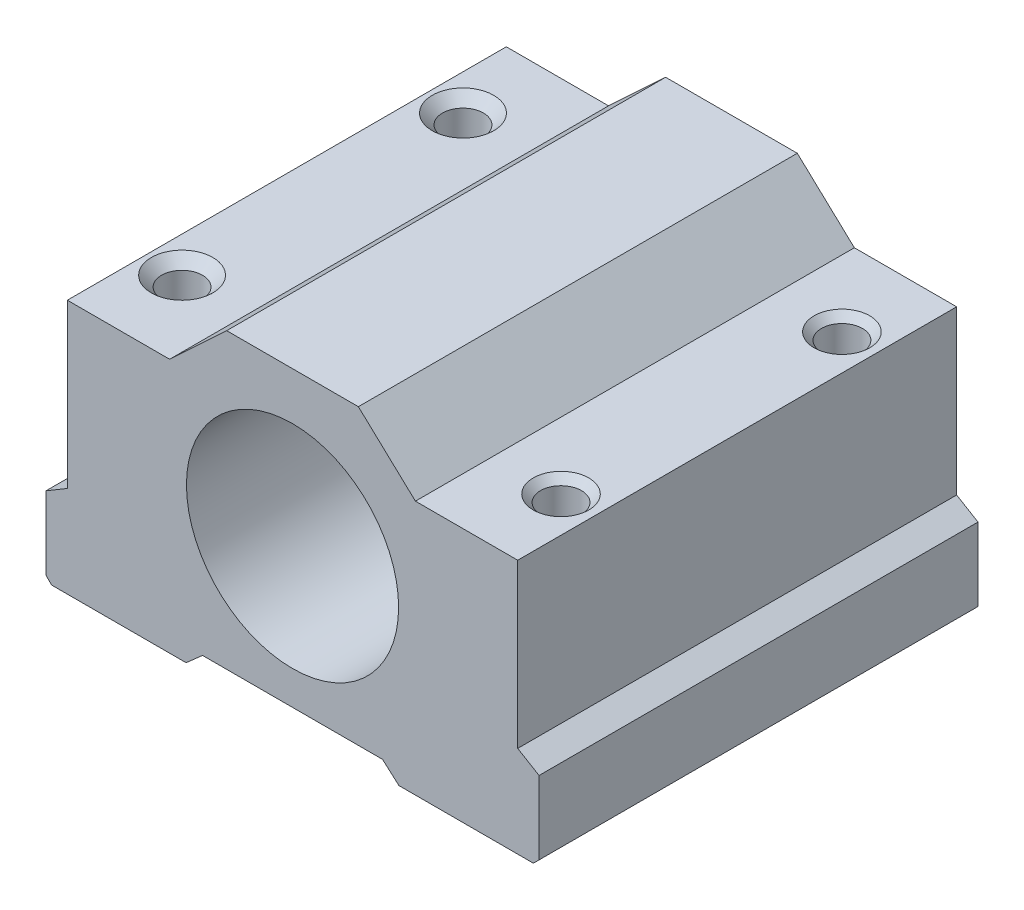
ISO-10303-21;
HEADER;
FILE_DESCRIPTION(('STEP AP214'),'2;1');
FILE_NAME('part.step','',(''),(''),'','','');
FILE_SCHEMA(('AUTOMOTIVE_DESIGN { 1 0 10303 214 1 1 1 1 }'));
ENDSEC;
DATA;
#1=APPLICATION_CONTEXT('core data for automotive mechanical design processes');
#2=APPLICATION_PROTOCOL_DEFINITION('international standard','automotive_design',2000,#1);
#3=PRODUCT_CONTEXT('',#1,'mechanical');
#4=PRODUCT('Part','Part','',(#3));
#5=PRODUCT_RELATED_PRODUCT_CATEGORY('part','',(#4));
#6=PRODUCT_DEFINITION_FORMATION('','',#4);
#7=PRODUCT_DEFINITION_CONTEXT('part definition',#1,'design');
#8=PRODUCT_DEFINITION('design','',#6,#7);
#9=PRODUCT_DEFINITION_SHAPE('','',#8);
#10=(LENGTH_UNIT() NAMED_UNIT(*) SI_UNIT(.MILLI.,.METRE.));
#11=(NAMED_UNIT(*) PLANE_ANGLE_UNIT() SI_UNIT($,.RADIAN.));
#12=(NAMED_UNIT(*) SI_UNIT($,.STERADIAN.) SOLID_ANGLE_UNIT());
#13=UNCERTAINTY_MEASURE_WITH_UNIT(LENGTH_MEASURE(1.E-05),#10,'distance_accuracy_value','');
#14=(GEOMETRIC_REPRESENTATION_CONTEXT(3) GLOBAL_UNCERTAINTY_ASSIGNED_CONTEXT((#13)) GLOBAL_UNIT_ASSIGNED_CONTEXT((#10,
#11,#12)) REPRESENTATION_CONTEXT('',''));
#15=CARTESIAN_POINT('',(0.,0.,0.));
#16=DIRECTION('',(0.,0.,1.));
#17=DIRECTION('',(1.,0.,0.));
#18=AXIS2_PLACEMENT_3D('',#15,#16,#17);
#19=CARTESIAN_POINT('',(16.85,-0.603248011996622,-30.));
#20=DIRECTION('',(-0.707106781186536,0.707106781186559,0.));
#21=DIRECTION('',(-0.707106781186559,-0.707106781186536,0.));
#22=AXIS2_PLACEMENT_3D('',#19,#20,#21);
#23=PLANE('',#22);
#24=DIRECTION('',(-0.707106781186559,-0.707106781186536,0.));
#25=VECTOR('',#24,1.);
#26=CARTESIAN_POINT('',(16.85,-0.603248011996622,0.));
#27=LINE('',#26,#25);
#28=CARTESIAN_POINT('',(16.85,-0.603248011996622,0.));
#29=VERTEX_POINT('',#28);
#30=CARTESIAN_POINT('',(16.4610912703474,-0.992156741649219,0.));
#31=VERTEX_POINT('',#30);
#32=EDGE_CURVE('E266',#29,#31,#27,.T.);
#33=ORIENTED_EDGE('',*,*,#32,.T.);
#34=DIRECTION('',(0.,0.,1.));
#35=VECTOR('',#34,1.);
#36=CARTESIAN_POINT('',(16.4610912703474,-0.992156741649219,-30.));
#37=LINE('',#36,#35);
#38=CARTESIAN_POINT('',(16.4610912703474,-0.992156741649219,-30.));
#39=VERTEX_POINT('',#38);
#40=EDGE_CURVE('E379',#39,#31,#37,.T.);
#41=ORIENTED_EDGE('',*,*,#40,.F.);
#42=DIRECTION('',(-0.707106781186559,-0.707106781186536,0.));
#43=VECTOR('',#42,1.);
#44=CARTESIAN_POINT('',(16.85,-0.603248011996622,-30.));
#45=LINE('',#44,#43);
#46=CARTESIAN_POINT('',(16.85,-0.603248011996622,-30.));
#47=VERTEX_POINT('',#46);
#48=EDGE_CURVE('E330',#47,#39,#45,.T.);
#49=ORIENTED_EDGE('',*,*,#48,.F.);
#50=DIRECTION('',(0.,0.,1.));
#51=VECTOR('',#50,1.);
#52=CARTESIAN_POINT('',(16.85,-0.603248011996622,-30.));
#53=LINE('',#52,#51);
#54=EDGE_CURVE('E262',#47,#29,#53,.T.);
#55=ORIENTED_EDGE('',*,*,#54,.T.);
#56=EDGE_LOOP('',(#33,#41,#49,#55));
#57=FACE_BOUND('',#56,.T.);
#58=ADVANCED_FACE('F102',(#57),#23,.F.);
#59=CARTESIAN_POINT('',(16.4610912703474,-0.992156741649219,-30.));
#60=DIRECTION('',(0.,1.,0.));
#61=DIRECTION('',(-1.,0.,0.));
#62=AXIS2_PLACEMENT_3D('',#59,#60,#61);
#63=PLANE('',#62);
#64=CARTESIAN_POINT('',(12.95,-0.99215674164922,-24.6));
#65=DIRECTION('',(0.,1.,0.));
#66=DIRECTION('',(-1.,0.,0.));
#67=AXIS2_PLACEMENT_3D('',#64,#65,#66);
#68=CIRCLE('',#67,2.24999999999997);
#69=CARTESIAN_POINT('',(12.95,-0.99215674164922,-26.85));
#70=VERTEX_POINT('',#69);
#71=EDGE_CURVE('E390',#70,#70,#68,.T.);
#72=ORIENTED_EDGE('',*,*,#71,.T.);
#73=EDGE_LOOP('',(#72));
#74=FACE_BOUND('',#73,.T.);
#75=CARTESIAN_POINT('',(12.95,-0.99215674164922,-5.4));
#76=DIRECTION('',(0.,1.,0.));
#77=DIRECTION('',(-1.,0.,0.));
#78=AXIS2_PLACEMENT_3D('',#75,#76,#77);
#79=CIRCLE('',#78,2.24999999999999);
#80=CARTESIAN_POINT('',(10.7,-0.99215674164922,-5.4));
#81=VERTEX_POINT('',#80);
#82=EDGE_CURVE('E386',#81,#81,#79,.T.);
#83=ORIENTED_EDGE('',*,*,#82,.T.);
#84=EDGE_LOOP('',(#83));
#85=FACE_BOUND('',#84,.T.);
#86=DIRECTION('',(-1.,0.,0.));
#87=VECTOR('',#86,1.);
#88=CARTESIAN_POINT('',(16.4610912703474,-0.992156741649219,0.));
#89=LINE('',#88,#87);
#90=CARTESIAN_POINT('',(7.275,-0.992156741649222,0.));
#91=VERTEX_POINT('',#90);
#92=EDGE_CURVE('E270',#31,#91,#89,.T.);
#93=ORIENTED_EDGE('',*,*,#92,.T.);
#94=DIRECTION('',(0.,0.,1.));
#95=VECTOR('',#94,1.);
#96=CARTESIAN_POINT('',(7.275,-0.992156741649222,-30.));
#97=LINE('',#96,#95);
#98=CARTESIAN_POINT('',(7.275,-0.992156741649222,-30.));
#99=VERTEX_POINT('',#98);
#100=EDGE_CURVE('E375',#99,#91,#97,.T.);
#101=ORIENTED_EDGE('',*,*,#100,.F.);
#102=DIRECTION('',(-1.,0.,0.));
#103=VECTOR('',#102,1.);
#104=CARTESIAN_POINT('',(16.4610912703474,-0.992156741649219,-30.));
#105=LINE('',#104,#103);
#106=EDGE_CURVE('E195',#39,#99,#105,.T.);
#107=ORIENTED_EDGE('',*,*,#106,.F.);
#108=ORIENTED_EDGE('',*,*,#40,.T.);
#109=EDGE_LOOP('',(#93,#101,#107,#108));
#110=FACE_BOUND('',#109,.T.);
#111=ADVANCED_FACE('F477',(#74,#85,#110),#63,.F.);
#112=CARTESIAN_POINT('',(7.275,-0.992156741649222,-30.));
#113=DIRECTION('',(0.661437827766148,0.75,0.));
#114=DIRECTION('',(-0.75,0.661437827766148,0.));
#115=AXIS2_PLACEMENT_3D('',#112,#113,#114);
#116=PLANE('',#115);
#117=DIRECTION('',(-0.75,0.661437827766148,0.));
#118=VECTOR('',#117,1.);
#119=CARTESIAN_POINT('',(7.275,-0.992156741649222,0.));
#120=LINE('',#119,#118);
#121=CARTESIAN_POINT('',(6.15,0.,0.));
#122=VERTEX_POINT('',#121);
#123=EDGE_CURVE('E274',#91,#122,#120,.T.);
#124=ORIENTED_EDGE('',*,*,#123,.T.);
#125=DIRECTION('',(0.,0.,1.));
#126=VECTOR('',#125,1.);
#127=CARTESIAN_POINT('',(6.15,0.,-30.));
#128=LINE('',#127,#126);
#129=CARTESIAN_POINT('',(6.15,0.,-30.));
#130=VERTEX_POINT('',#129);
#131=EDGE_CURVE('E372',#130,#122,#128,.T.);
#132=ORIENTED_EDGE('',*,*,#131,.F.);
#133=DIRECTION('',(-0.75,0.661437827766148,0.));
#134=VECTOR('',#133,1.);
#135=CARTESIAN_POINT('',(7.275,-0.992156741649222,-30.));
#136=LINE('',#135,#134);
#137=EDGE_CURVE('E630',#99,#130,#136,.T.);
#138=ORIENTED_EDGE('',*,*,#137,.F.);
#139=ORIENTED_EDGE('',*,*,#100,.T.);
#140=EDGE_LOOP('',(#124,#132,#138,#139));
#141=FACE_BOUND('',#140,.T.);
#142=ADVANCED_FACE('F483',(#141),#116,.F.);
#143=CARTESIAN_POINT('',(-6.15,0.,-30.));
#144=DIRECTION('',(0.,-1.,0.));
#145=DIRECTION('',(0.,0.,-1.));
#146=AXIS2_PLACEMENT_3D('',#143,#144,#145);
#147=PLANE('',#146);
#148=DIRECTION('',(1.,0.,0.));
#149=VECTOR('',#148,1.);
#150=CARTESIAN_POINT('',(-6.15,0.,0.));
#151=LINE('',#150,#149);
#152=CARTESIAN_POINT('',(-6.15,0.,0.));
#153=VERTEX_POINT('',#152);
#154=EDGE_CURVE('E278',#153,#122,#151,.T.);
#155=ORIENTED_EDGE('',*,*,#154,.F.);
#156=DIRECTION('',(0.,0.,1.));
#157=VECTOR('',#156,1.);
#158=CARTESIAN_POINT('',(-6.15,0.,-30.));
#159=LINE('',#158,#157);
#160=CARTESIAN_POINT('',(-6.15,0.,-30.));
#161=VERTEX_POINT('',#160);
#162=EDGE_CURVE('E369',#161,#153,#159,.T.);
#163=ORIENTED_EDGE('',*,*,#162,.F.);
#164=DIRECTION('',(1.,0.,0.));
#165=VECTOR('',#164,1.);
#166=CARTESIAN_POINT('',(-6.15,0.,-30.));
#167=LINE('',#166,#165);
#168=EDGE_CURVE('E625',#161,#130,#167,.T.);
#169=ORIENTED_EDGE('',*,*,#168,.T.);
#170=ORIENTED_EDGE('',*,*,#131,.T.);
#171=EDGE_LOOP('',(#155,#163,#169,#170));
#172=FACE_BOUND('',#171,.T.);
#173=ADVANCED_FACE('F611',(#172),#147,.T.);
#174=CARTESIAN_POINT('',(-7.275,-0.992156741649222,-30.));
#175=DIRECTION('',(0.661437827766148,-0.75,0.));
#176=DIRECTION('',(0.75,0.661437827766148,0.));
#177=AXIS2_PLACEMENT_3D('',#174,#175,#176);
#178=PLANE('',#177);
#179=DIRECTION('',(0.75,0.661437827766148,0.));
#180=VECTOR('',#179,1.);
#181=CARTESIAN_POINT('',(-7.275,-0.992156741649222,0.));
#182=LINE('',#181,#180);
#183=CARTESIAN_POINT('',(-7.275,-0.992156741649222,0.));
#184=VERTEX_POINT('',#183);
#185=EDGE_CURVE('E282',#184,#153,#182,.T.);
#186=ORIENTED_EDGE('',*,*,#185,.F.);
#187=DIRECTION('',(0.,0.,1.));
#188=VECTOR('',#187,1.);
#189=CARTESIAN_POINT('',(-7.275,-0.992156741649222,-30.));
#190=LINE('',#189,#188);
#191=CARTESIAN_POINT('',(-7.275,-0.992156741649222,-30.));
#192=VERTEX_POINT('',#191);
#193=EDGE_CURVE('E366',#192,#184,#190,.T.);
#194=ORIENTED_EDGE('',*,*,#193,.F.);
#195=DIRECTION('',(0.75,0.661437827766148,0.));
#196=VECTOR('',#195,1.);
#197=CARTESIAN_POINT('',(-7.275,-0.992156741649222,-30.));
#198=LINE('',#197,#196);
#199=EDGE_CURVE('E629',#192,#161,#198,.T.);
#200=ORIENTED_EDGE('',*,*,#199,.T.);
#201=ORIENTED_EDGE('',*,*,#162,.T.);
#202=EDGE_LOOP('',(#186,#194,#200,#201));
#203=FACE_BOUND('',#202,.T.);
#204=ADVANCED_FACE('F607',(#203),#178,.T.);
#205=CARTESIAN_POINT('',(-16.4610912703474,-0.992156741649217,-30.));
#206=DIRECTION('',(0.,-1.,0.));
#207=DIRECTION('',(1.,0.,0.));
#208=AXIS2_PLACEMENT_3D('',#205,#206,#207);
#209=PLANE('',#208);
#210=CARTESIAN_POINT('',(-12.95,-0.992156741649219,-5.4));
#211=DIRECTION('',(0.,-1.,0.));
#212=DIRECTION('',(1.,0.,0.));
#213=AXIS2_PLACEMENT_3D('',#210,#211,#212);
#214=CIRCLE('',#213,2.25000000000002);
#215=CARTESIAN_POINT('',(-10.7,-0.99215674164922,-5.4));
#216=VERTEX_POINT('',#215);
#217=EDGE_CURVE('E406',#216,#216,#214,.F.);
#218=ORIENTED_EDGE('',*,*,#217,.T.);
#219=EDGE_LOOP('',(#218));
#220=FACE_BOUND('',#219,.T.);
#221=CARTESIAN_POINT('',(-12.95,-0.992156741649219,-24.6));
#222=DIRECTION('',(0.,-1.,0.));
#223=DIRECTION('',(1.,0.,0.));
#224=AXIS2_PLACEMENT_3D('',#221,#222,#223);
#225=CIRCLE('',#224,2.25000000000001);
#226=CARTESIAN_POINT('',(-10.7,-0.99215674164922,-24.6));
#227=VERTEX_POINT('',#226);
#228=EDGE_CURVE('E402',#227,#227,#225,.F.);
#229=ORIENTED_EDGE('',*,*,#228,.T.);
#230=EDGE_LOOP('',(#229));
#231=FACE_BOUND('',#230,.T.);
#232=DIRECTION('',(1.,0.,0.));
#233=VECTOR('',#232,1.);
#234=CARTESIAN_POINT('',(-16.4610912703474,-0.992156741649217,0.));
#235=LINE('',#234,#233);
#236=CARTESIAN_POINT('',(-16.4610912703474,-0.992156741649217,0.));
#237=VERTEX_POINT('',#236);
#238=EDGE_CURVE('E286',#237,#184,#235,.T.);
#239=ORIENTED_EDGE('',*,*,#238,.F.);
#240=DIRECTION('',(0.,0.,1.));
#241=VECTOR('',#240,1.);
#242=CARTESIAN_POINT('',(-16.4610912703474,-0.992156741649217,-30.));
#243=LINE('',#242,#241);
#244=CARTESIAN_POINT('',(-16.4610912703474,-0.992156741649217,-30.));
#245=VERTEX_POINT('',#244);
#246=EDGE_CURVE('E363',#245,#237,#243,.T.);
#247=ORIENTED_EDGE('',*,*,#246,.F.);
#248=DIRECTION('',(1.,0.,0.));
#249=VECTOR('',#248,1.);
#250=CARTESIAN_POINT('',(-16.4610912703474,-0.992156741649217,-30.));
#251=LINE('',#250,#249);
#252=EDGE_CURVE('E634',#245,#192,#251,.T.);
#253=ORIENTED_EDGE('',*,*,#252,.T.);
#254=ORIENTED_EDGE('',*,*,#193,.T.);
#255=EDGE_LOOP('',(#239,#247,#253,#254));
#256=FACE_BOUND('',#255,.T.);
#257=ADVANCED_FACE('F603',(#220,#231,#256),#209,.T.);
#258=CARTESIAN_POINT('',(-16.85,-0.603248011996622,-30.));
#259=DIRECTION('',(-0.707106781186535,-0.70710678118656,0.));
#260=DIRECTION('',(0.70710678118656,-0.707106781186535,0.));
#261=AXIS2_PLACEMENT_3D('',#258,#259,#260);
#262=PLANE('',#261);
#263=DIRECTION('',(0.70710678118656,-0.707106781186535,0.));
#264=VECTOR('',#263,1.);
#265=CARTESIAN_POINT('',(-16.85,-0.603248011996622,0.));
#266=LINE('',#265,#264);
#267=CARTESIAN_POINT('',(-16.85,-0.603248011996622,0.));
#268=VERTEX_POINT('',#267);
#269=EDGE_CURVE('E290',#268,#237,#266,.T.);
#270=ORIENTED_EDGE('',*,*,#269,.F.);
#271=DIRECTION('',(0.,0.,1.));
#272=VECTOR('',#271,1.);
#273=CARTESIAN_POINT('',(-16.85,-0.603248011996622,-30.));
#274=LINE('',#273,#272);
#275=CARTESIAN_POINT('',(-16.85,-0.603248011996622,-30.));
#276=VERTEX_POINT('',#275);
#277=EDGE_CURVE('E360',#276,#268,#274,.T.);
#278=ORIENTED_EDGE('',*,*,#277,.F.);
#279=DIRECTION('',(0.70710678118656,-0.707106781186535,0.));
#280=VECTOR('',#279,1.);
#281=CARTESIAN_POINT('',(-16.85,-0.603248011996622,-30.));
#282=LINE('',#281,#280);
#283=EDGE_CURVE('E642',#276,#245,#282,.T.);
#284=ORIENTED_EDGE('',*,*,#283,.T.);
#285=ORIENTED_EDGE('',*,*,#246,.T.);
#286=EDGE_LOOP('',(#270,#278,#284,#285));
#287=FACE_BOUND('',#286,.T.);
#288=ADVANCED_FACE('F599',(#287),#262,.T.);
#289=CARTESIAN_POINT('',(-16.85,4.39675198800338,-30.));
#290=DIRECTION('',(-1.,0.,0.));
#291=DIRECTION('',(0.,0.,1.));
#292=AXIS2_PLACEMENT_3D('',#289,#290,#291);
#293=PLANE('',#292);
#294=DIRECTION('',(0.,-1.,0.));
#295=VECTOR('',#294,1.);
#296=CARTESIAN_POINT('',(-16.85,4.39675198800338,0.));
#297=LINE('',#296,#295);
#298=CARTESIAN_POINT('',(-16.85,4.39675198800338,0.));
#299=VERTEX_POINT('',#298);
#300=EDGE_CURVE('E294',#299,#268,#297,.T.);
#301=ORIENTED_EDGE('',*,*,#300,.F.);
#302=DIRECTION('',(0.,0.,1.));
#303=VECTOR('',#302,1.);
#304=CARTESIAN_POINT('',(-16.85,4.39675198800338,-30.));
#305=LINE('',#304,#303);
#306=CARTESIAN_POINT('',(-16.85,4.39675198800338,-30.));
#307=VERTEX_POINT('',#306);
#308=EDGE_CURVE('E357',#307,#299,#305,.T.);
#309=ORIENTED_EDGE('',*,*,#308,.F.);
#310=DIRECTION('',(0.,-1.,0.));
#311=VECTOR('',#310,1.);
#312=CARTESIAN_POINT('',(-16.85,4.39675198800338,-30.));
#313=LINE('',#312,#311);
#314=EDGE_CURVE('E646',#307,#276,#313,.T.);
#315=ORIENTED_EDGE('',*,*,#314,.T.);
#316=ORIENTED_EDGE('',*,*,#277,.T.);
#317=EDGE_LOOP('',(#301,#309,#315,#316));
#318=FACE_BOUND('',#317,.T.);
#319=ADVANCED_FACE('F595',(#318),#293,.T.);
#320=CARTESIAN_POINT('',(-15.39,5.26761363028646,-30.));
#321=DIRECTION('',(-0.512271554284168,0.858823529411766,0.));
#322=DIRECTION('',(-0.858823529411766,-0.512271554284168,0.));
#323=AXIS2_PLACEMENT_3D('',#320,#321,#322);
#324=PLANE('',#323);
#325=DIRECTION('',(-0.858823529411766,-0.512271554284168,0.));
#326=VECTOR('',#325,1.);
#327=CARTESIAN_POINT('',(-15.39,5.26761363028646,0.));
#328=LINE('',#327,#326);
#329=CARTESIAN_POINT('',(-15.39,5.26761363028646,0.));
#330=VERTEX_POINT('',#329);
#331=EDGE_CURVE('E298',#330,#299,#328,.T.);
#332=ORIENTED_EDGE('',*,*,#331,.F.);
#333=DIRECTION('',(0.,0.,1.));
#334=VECTOR('',#333,1.);
#335=CARTESIAN_POINT('',(-15.39,5.26761363028646,-30.));
#336=LINE('',#335,#334);
#337=CARTESIAN_POINT('',(-15.39,5.26761363028646,-30.));
#338=VERTEX_POINT('',#337);
#339=EDGE_CURVE('E354',#338,#330,#336,.T.);
#340=ORIENTED_EDGE('',*,*,#339,.F.);
#341=DIRECTION('',(-0.858823529411766,-0.512271554284168,0.));
#342=VECTOR('',#341,1.);
#343=CARTESIAN_POINT('',(-15.39,5.26761363028646,-30.));
#344=LINE('',#343,#342);
#345=EDGE_CURVE('E650',#338,#307,#344,.T.);
#346=ORIENTED_EDGE('',*,*,#345,.T.);
#347=ORIENTED_EDGE('',*,*,#308,.T.);
#348=EDGE_LOOP('',(#332,#340,#346,#347));
#349=FACE_BOUND('',#348,.T.);
#350=ADVANCED_FACE('F591',(#349),#324,.T.);
#351=CARTESIAN_POINT('',(-15.39,16.4078432583508,-30.));
#352=DIRECTION('',(-1.,0.,0.));
#353=DIRECTION('',(0.,-1.,0.));
#354=AXIS2_PLACEMENT_3D('',#351,#352,#353);
#355=PLANE('',#354);
#356=DIRECTION('',(0.,-1.,0.));
#357=VECTOR('',#356,1.);
#358=CARTESIAN_POINT('',(-15.39,16.4078432583508,0.));
#359=LINE('',#358,#357);
#360=CARTESIAN_POINT('',(-15.39,16.4078432583508,0.));
#361=VERTEX_POINT('',#360);
#362=EDGE_CURVE('E302',#361,#330,#359,.T.);
#363=ORIENTED_EDGE('',*,*,#362,.F.);
#364=DIRECTION('',(0.,0.,1.));
#365=VECTOR('',#364,1.);
#366=CARTESIAN_POINT('',(-15.39,16.4078432583508,-30.));
#367=LINE('',#366,#365);
#368=CARTESIAN_POINT('',(-15.39,16.4078432583508,-30.));
#369=VERTEX_POINT('',#368);
#370=EDGE_CURVE('E351',#369,#361,#367,.T.);
#371=ORIENTED_EDGE('',*,*,#370,.F.);
#372=DIRECTION('',(0.,-1.,0.));
#373=VECTOR('',#372,1.);
#374=CARTESIAN_POINT('',(-15.39,16.4078432583508,-30.));
#375=LINE('',#374,#373);
#376=EDGE_CURVE('E654',#369,#338,#375,.T.);
#377=ORIENTED_EDGE('',*,*,#376,.T.);
#378=ORIENTED_EDGE('',*,*,#339,.T.);
#379=EDGE_LOOP('',(#363,#371,#377,#378));
#380=FACE_BOUND('',#379,.T.);
#381=ADVANCED_FACE('F527',(#380),#355,.T.);
#382=CARTESIAN_POINT('',(-15.39,16.4078432583508,-30.));
#383=DIRECTION('',(0.,-1.,0.));
#384=DIRECTION('',(0.,0.,-1.));
#385=AXIS2_PLACEMENT_3D('',#382,#383,#384);
#386=PLANE('',#385);
#387=CARTESIAN_POINT('',(-12.95,16.4078432583508,-24.6));
#388=DIRECTION('',(0.,-1.,0.));
#389=DIRECTION('',(0.,0.,-1.));
#390=AXIS2_PLACEMENT_3D('',#387,#388,#389);
#391=CIRCLE('',#390,2.09999999999998);
#392=CARTESIAN_POINT('',(-12.95,16.4078432583508,-26.7));
#393=VERTEX_POINT('',#392);
#394=EDGE_CURVE('E418',#393,#393,#391,.T.);
#395=ORIENTED_EDGE('',*,*,#394,.T.);
#396=EDGE_LOOP('',(#395));
#397=FACE_BOUND('',#396,.T.);
#398=CARTESIAN_POINT('',(-12.95,16.4078432583508,-5.4));
#399=DIRECTION('',(0.,-1.,0.));
#400=DIRECTION('',(0.,0.,-1.));
#401=AXIS2_PLACEMENT_3D('',#398,#399,#400);
#402=CIRCLE('',#401,2.09999999999999);
#403=CARTESIAN_POINT('',(-12.95,16.4078432583508,-7.49999999999999));
#404=VERTEX_POINT('',#403);
#405=EDGE_CURVE('E414',#404,#404,#402,.T.);
#406=ORIENTED_EDGE('',*,*,#405,.T.);
#407=EDGE_LOOP('',(#406));
#408=FACE_BOUND('',#407,.T.);
#409=DIRECTION('',(1.,0.,0.));
#410=VECTOR('',#409,1.);
#411=CARTESIAN_POINT('',(-15.39,16.4078432583508,0.));
#412=LINE('',#411,#410);
#413=CARTESIAN_POINT('',(-8.4,16.4078432583508,0.));
#414=VERTEX_POINT('',#413);
#415=EDGE_CURVE('E306',#361,#414,#412,.T.);
#416=ORIENTED_EDGE('',*,*,#415,.T.);
#417=DIRECTION('',(0.,0.,1.));
#418=VECTOR('',#417,1.);
#419=CARTESIAN_POINT('',(-8.4,16.4078432583508,-30.));
#420=LINE('',#419,#418);
#421=CARTESIAN_POINT('',(-8.4,16.4078432583508,-30.));
#422=VERTEX_POINT('',#421);
#423=EDGE_CURVE('E347',#422,#414,#420,.T.);
#424=ORIENTED_EDGE('',*,*,#423,.F.);
#425=DIRECTION('',(1.,0.,0.));
#426=VECTOR('',#425,1.);
#427=CARTESIAN_POINT('',(-15.39,16.4078432583508,-30.));
#428=LINE('',#427,#426);
#429=EDGE_CURVE('E556',#369,#422,#428,.T.);
#430=ORIENTED_EDGE('',*,*,#429,.F.);
#431=ORIENTED_EDGE('',*,*,#370,.T.);
#432=EDGE_LOOP('',(#416,#424,#430,#431));
#433=FACE_BOUND('',#432,.T.);
#434=ADVANCED_FACE('F523',(#397,#408,#433),#386,.F.);
#435=CARTESIAN_POINT('',(-8.4,16.4078432583508,-30.));
#436=DIRECTION('',(0.682534225847145,-0.730853631411406,0.));
#437=DIRECTION('',(0.730853631411406,0.682534225847145,0.));
#438=AXIS2_PLACEMENT_3D('',#435,#436,#437);
#439=PLANE('',#438);
#440=DIRECTION('',(0.730853631411406,0.682534225847145,0.));
#441=VECTOR('',#440,1.);
#442=CARTESIAN_POINT('',(-8.4,16.4078432583508,0.));
#443=LINE('',#442,#441);
#444=CARTESIAN_POINT('',(-4.5,20.05,0.));
#445=VERTEX_POINT('',#444);
#446=EDGE_CURVE('E309',#414,#445,#443,.T.);
#447=ORIENTED_EDGE('',*,*,#446,.T.);
#448=DIRECTION('',(0.,0.,1.));
#449=VECTOR('',#448,1.);
#450=CARTESIAN_POINT('',(-4.5,20.05,-30.));
#451=LINE('',#450,#449);
#452=CARTESIAN_POINT('',(-4.5,20.05,-30.));
#453=VERTEX_POINT('',#452);
#454=EDGE_CURVE('E343',#453,#445,#451,.T.);
#455=ORIENTED_EDGE('',*,*,#454,.F.);
#456=DIRECTION('',(0.730853631411406,0.682534225847145,0.));
#457=VECTOR('',#456,1.);
#458=CARTESIAN_POINT('',(-8.4,16.4078432583508,-30.));
#459=LINE('',#458,#457);
#460=EDGE_CURVE('E539',#422,#453,#459,.T.);
#461=ORIENTED_EDGE('',*,*,#460,.F.);
#462=ORIENTED_EDGE('',*,*,#423,.T.);
#463=EDGE_LOOP('',(#447,#455,#461,#462));
#464=FACE_BOUND('',#463,.T.);
#465=ADVANCED_FACE('F526',(#464),#439,.F.);
#466=CARTESIAN_POINT('',(-4.5,20.05,-30.));
#467=DIRECTION('',(0.,-1.,0.));
#468=DIRECTION('',(0.,0.,-1.));
#469=AXIS2_PLACEMENT_3D('',#466,#467,#468);
#470=PLANE('',#469);
#471=DIRECTION('',(1.,0.,0.));
#472=VECTOR('',#471,1.);
#473=CARTESIAN_POINT('',(-4.5,20.05,0.));
#474=LINE('',#473,#472);
#475=CARTESIAN_POINT('',(4.5,20.05,0.));
#476=VERTEX_POINT('',#475);
#477=EDGE_CURVE('E312',#445,#476,#474,.T.);
#478=ORIENTED_EDGE('',*,*,#477,.T.);
#479=DIRECTION('',(0.,0.,1.));
#480=VECTOR('',#479,1.);
#481=CARTESIAN_POINT('',(4.5,20.05,-30.));
#482=LINE('',#481,#480);
#483=CARTESIAN_POINT('',(4.5,20.05,-30.));
#484=VERTEX_POINT('',#483);
#485=EDGE_CURVE('E340',#484,#476,#482,.T.);
#486=ORIENTED_EDGE('',*,*,#485,.F.);
#487=DIRECTION('',(1.,0.,0.));
#488=VECTOR('',#487,1.);
#489=CARTESIAN_POINT('',(-4.5,20.05,-30.));
#490=LINE('',#489,#488);
#491=EDGE_CURVE('E549',#453,#484,#490,.T.);
#492=ORIENTED_EDGE('',*,*,#491,.F.);
#493=ORIENTED_EDGE('',*,*,#454,.T.);
#494=EDGE_LOOP('',(#478,#486,#492,#493));
#495=FACE_BOUND('',#494,.T.);
#496=ADVANCED_FACE('F546',(#495),#470,.F.);
#497=CARTESIAN_POINT('',(8.4,16.4078432583508,-30.));
#498=DIRECTION('',(0.682534225847145,0.730853631411406,0.));
#499=DIRECTION('',(-0.730853631411406,0.682534225847145,0.));
#500=AXIS2_PLACEMENT_3D('',#497,#498,#499);
#501=PLANE('',#500);
#502=DIRECTION('',(-0.730853631411406,0.682534225847145,0.));
#503=VECTOR('',#502,1.);
#504=CARTESIAN_POINT('',(8.4,16.4078432583508,0.));
#505=LINE('',#504,#503);
#506=CARTESIAN_POINT('',(8.4,16.4078432583508,0.));
#507=VERTEX_POINT('',#506);
#508=EDGE_CURVE('E316',#507,#476,#505,.T.);
#509=ORIENTED_EDGE('',*,*,#508,.F.);
#510=DIRECTION('',(0.,0.,1.));
#511=VECTOR('',#510,1.);
#512=CARTESIAN_POINT('',(8.4,16.4078432583508,-30.));
#513=LINE('',#512,#511);
#514=CARTESIAN_POINT('',(8.4,16.4078432583508,-30.));
#515=VERTEX_POINT('',#514);
#516=EDGE_CURVE('E337',#515,#507,#513,.T.);
#517=ORIENTED_EDGE('',*,*,#516,.F.);
#518=DIRECTION('',(-0.730853631411406,0.682534225847145,0.));
#519=VECTOR('',#518,1.);
#520=CARTESIAN_POINT('',(8.4,16.4078432583508,-30.));
#521=LINE('',#520,#519);
#522=EDGE_CURVE('E551',#515,#484,#521,.T.);
#523=ORIENTED_EDGE('',*,*,#522,.T.);
#524=ORIENTED_EDGE('',*,*,#485,.T.);
#525=EDGE_LOOP('',(#509,#517,#523,#524));
#526=FACE_BOUND('',#525,.T.);
#527=ADVANCED_FACE('F581',(#526),#501,.T.);
#528=CARTESIAN_POINT('',(15.39,16.4078432583508,-30.));
#529=DIRECTION('',(0.,1.,0.));
#530=DIRECTION('',(0.,0.,1.));
#531=AXIS2_PLACEMENT_3D('',#528,#529,#530);
#532=PLANE('',#531);
#533=CARTESIAN_POINT('',(12.95,16.4078432583508,-5.4));
#534=DIRECTION('',(0.,1.,0.));
#535=DIRECTION('',(0.,0.,1.));
#536=AXIS2_PLACEMENT_3D('',#533,#534,#535);
#537=CIRCLE('',#536,1.9);
#538=CARTESIAN_POINT('',(12.95,16.4078432583508,-3.5));
#539=VERTEX_POINT('',#538);
#540=EDGE_CURVE('E113',#539,#539,#537,.F.);
#541=ORIENTED_EDGE('',*,*,#540,.T.);
#542=EDGE_LOOP('',(#541));
#543=FACE_BOUND('',#542,.T.);
#544=CARTESIAN_POINT('',(12.95,16.4078432583508,-24.6));
#545=DIRECTION('',(0.,1.,0.));
#546=DIRECTION('',(0.,0.,1.));
#547=AXIS2_PLACEMENT_3D('',#544,#545,#546);
#548=CIRCLE('',#547,1.9);
#549=CARTESIAN_POINT('',(12.95,16.4078432583508,-22.7));
#550=VERTEX_POINT('',#549);
#551=EDGE_CURVE('E434',#550,#550,#548,.F.);
#552=ORIENTED_EDGE('',*,*,#551,.T.);
#553=EDGE_LOOP('',(#552));
#554=FACE_BOUND('',#553,.T.);
#555=DIRECTION('',(-1.,0.,0.));
#556=VECTOR('',#555,1.);
#557=CARTESIAN_POINT('',(15.39,16.4078432583508,0.));
#558=LINE('',#557,#556);
#559=CARTESIAN_POINT('',(15.39,16.4078432583508,0.));
#560=VERTEX_POINT('',#559);
#561=EDGE_CURVE('E320',#560,#507,#558,.T.);
#562=ORIENTED_EDGE('',*,*,#561,.F.);
#563=DIRECTION('',(0.,0.,1.));
#564=VECTOR('',#563,1.);
#565=CARTESIAN_POINT('',(15.39,16.4078432583508,-30.));
#566=LINE('',#565,#564);
#567=CARTESIAN_POINT('',(15.39,16.4078432583508,-30.));
#568=VERTEX_POINT('',#567);
#569=EDGE_CURVE('E255',#568,#560,#566,.T.);
#570=ORIENTED_EDGE('',*,*,#569,.F.);
#571=DIRECTION('',(-1.,0.,0.));
#572=VECTOR('',#571,1.);
#573=CARTESIAN_POINT('',(15.39,16.4078432583508,-30.));
#574=LINE('',#573,#572);
#575=EDGE_CURVE('E246',#568,#515,#574,.T.);
#576=ORIENTED_EDGE('',*,*,#575,.T.);
#577=ORIENTED_EDGE('',*,*,#516,.T.);
#578=EDGE_LOOP('',(#562,#570,#576,#577));
#579=FACE_BOUND('',#578,.T.);
#580=ADVANCED_FACE('F441',(#543,#554,#579),#532,.T.);
#581=CARTESIAN_POINT('',(15.39,16.4078432583508,-30.));
#582=DIRECTION('',(-1.,0.,0.));
#583=DIRECTION('',(0.,-1.,0.));
#584=AXIS2_PLACEMENT_3D('',#581,#582,#583);
#585=PLANE('',#584);
#586=DIRECTION('',(0.,-1.,0.));
#587=VECTOR('',#586,1.);
#588=CARTESIAN_POINT('',(15.39,16.4078432583508,0.));
#589=LINE('',#588,#587);
#590=CARTESIAN_POINT('',(15.39,5.26761363028646,0.));
#591=VERTEX_POINT('',#590);
#592=EDGE_CURVE('E253',#560,#591,#589,.T.);
#593=ORIENTED_EDGE('',*,*,#592,.T.);
#594=DIRECTION('',(0.,0.,1.));
#595=VECTOR('',#594,1.);
#596=CARTESIAN_POINT('',(15.39,5.26761363028646,-30.));
#597=LINE('',#596,#595);
#598=CARTESIAN_POINT('',(15.39,5.26761363028646,-30.));
#599=VERTEX_POINT('',#598);
#600=EDGE_CURVE('E250',#599,#591,#597,.T.);
#601=ORIENTED_EDGE('',*,*,#600,.F.);
#602=DIRECTION('',(0.,-1.,0.));
#603=VECTOR('',#602,1.);
#604=CARTESIAN_POINT('',(15.39,16.4078432583508,-30.));
#605=LINE('',#604,#603);
#606=EDGE_CURVE('E239',#568,#599,#605,.T.);
#607=ORIENTED_EDGE('',*,*,#606,.F.);
#608=ORIENTED_EDGE('',*,*,#569,.T.);
#609=EDGE_LOOP('',(#593,#601,#607,#608));
#610=FACE_BOUND('',#609,.T.);
#611=ADVANCED_FACE('F251',(#610),#585,.F.);
#612=CARTESIAN_POINT('',(15.39,5.26761363028646,-30.));
#613=DIRECTION('',(-0.512271554284168,-0.858823529411766,0.));
#614=DIRECTION('',(0.858823529411766,-0.512271554284168,0.));
#615=AXIS2_PLACEMENT_3D('',#612,#613,#614);
#616=PLANE('',#615);
#617=DIRECTION('',(0.858823529411766,-0.512271554284168,0.));
#618=VECTOR('',#617,1.);
#619=CARTESIAN_POINT('',(15.39,5.26761363028646,0.));
#620=LINE('',#619,#618);
#621=CARTESIAN_POINT('',(16.85,4.39675198800338,0.));
#622=VERTEX_POINT('',#621);
#623=EDGE_CURVE('E180',#591,#622,#620,.T.);
#624=ORIENTED_EDGE('',*,*,#623,.T.);
#625=DIRECTION('',(0.,0.,1.));
#626=VECTOR('',#625,1.);
#627=CARTESIAN_POINT('',(16.85,4.39675198800338,-30.));
#628=LINE('',#627,#626);
#629=CARTESIAN_POINT('',(16.85,4.39675198800338,-30.));
#630=VERTEX_POINT('',#629);
#631=EDGE_CURVE('E256',#630,#622,#628,.T.);
#632=ORIENTED_EDGE('',*,*,#631,.F.);
#633=DIRECTION('',(0.858823529411766,-0.512271554284168,0.));
#634=VECTOR('',#633,1.);
#635=CARTESIAN_POINT('',(15.39,5.26761363028646,-30.));
#636=LINE('',#635,#634);
#637=EDGE_CURVE('E243',#599,#630,#636,.T.);
#638=ORIENTED_EDGE('',*,*,#637,.F.);
#639=ORIENTED_EDGE('',*,*,#600,.T.);
#640=EDGE_LOOP('',(#624,#632,#638,#639));
#641=FACE_BOUND('',#640,.T.);
#642=ADVANCED_FACE('F258',(#641),#616,.F.);
#643=CARTESIAN_POINT('',(16.85,4.39675198800338,-30.));
#644=DIRECTION('',(-1.,0.,0.));
#645=DIRECTION('',(0.,0.,1.));
#646=AXIS2_PLACEMENT_3D('',#643,#644,#645);
#647=PLANE('',#646);
#648=DIRECTION('',(0.,-1.,0.));
#649=VECTOR('',#648,1.);
#650=CARTESIAN_POINT('',(16.85,4.39675198800338,0.));
#651=LINE('',#650,#649);
#652=EDGE_CURVE('E186',#622,#29,#651,.T.);
#653=ORIENTED_EDGE('',*,*,#652,.T.);
#654=ORIENTED_EDGE('',*,*,#54,.F.);
#655=DIRECTION('',(0.,-1.,0.));
#656=VECTOR('',#655,1.);
#657=CARTESIAN_POINT('',(16.85,4.39675198800338,-30.));
#658=LINE('',#657,#656);
#659=EDGE_CURVE('E121',#630,#47,#658,.T.);
#660=ORIENTED_EDGE('',*,*,#659,.F.);
#661=ORIENTED_EDGE('',*,*,#631,.T.);
#662=EDGE_LOOP('',(#653,#654,#660,#661));
#663=FACE_BOUND('',#662,.T.);
#664=ADVANCED_FACE('F565',(#663),#647,.F.);
#665=CARTESIAN_POINT('',(0.,0.,-30.));
#666=DIRECTION('',(0.,0.,1.));
#667=DIRECTION('',(1.,0.,0.));
#668=AXIS2_PLACEMENT_3D('',#665,#666,#667);
#669=PLANE('',#668);
#670=CARTESIAN_POINT('',(0.,9.55,-30.));
#671=DIRECTION('',(0.,0.,1.));
#672=DIRECTION('',(1.,0.,0.));
#673=AXIS2_PLACEMENT_3D('',#670,#671,#672);
#674=CIRCLE('',#673,7.25000000000001);
#675=CARTESIAN_POINT('',(7.25000000000001,9.55,-30.));
#676=VERTEX_POINT('',#675);
#677=EDGE_CURVE('E271',#676,#676,#674,.T.);
#678=ORIENTED_EDGE('',*,*,#677,.T.);
#679=EDGE_LOOP('',(#678));
#680=FACE_BOUND('',#679,.T.);
#681=ORIENTED_EDGE('',*,*,#48,.T.);
#682=ORIENTED_EDGE('',*,*,#106,.T.);
#683=ORIENTED_EDGE('',*,*,#137,.T.);
#684=ORIENTED_EDGE('',*,*,#168,.F.);
#685=ORIENTED_EDGE('',*,*,#199,.F.);
#686=ORIENTED_EDGE('',*,*,#252,.F.);
#687=ORIENTED_EDGE('',*,*,#283,.F.);
#688=ORIENTED_EDGE('',*,*,#314,.F.);
#689=ORIENTED_EDGE('',*,*,#345,.F.);
#690=ORIENTED_EDGE('',*,*,#376,.F.);
#691=ORIENTED_EDGE('',*,*,#429,.T.);
#692=ORIENTED_EDGE('',*,*,#460,.T.);
#693=ORIENTED_EDGE('',*,*,#491,.T.);
#694=ORIENTED_EDGE('',*,*,#522,.F.);
#695=ORIENTED_EDGE('',*,*,#575,.F.);
#696=ORIENTED_EDGE('',*,*,#606,.T.);
#697=ORIENTED_EDGE('',*,*,#637,.T.);
#698=ORIENTED_EDGE('',*,*,#659,.T.);
#699=EDGE_LOOP('',(#681,#682,#683,#684,#685,#686,#687,#688,#689,#690,#691,#692,#693,#694,#695,
#696,#697,#698));
#700=FACE_BOUND('',#699,.T.);
#701=ADVANCED_FACE('F241',(#680,#700),#669,.F.);
#702=CARTESIAN_POINT('',(0.,0.,0.));
#703=DIRECTION('',(0.,0.,1.));
#704=DIRECTION('',(1.,0.,0.));
#705=AXIS2_PLACEMENT_3D('',#702,#703,#704);
#706=PLANE('',#705);
#707=CARTESIAN_POINT('',(0.,9.55,0.));
#708=DIRECTION('',(0.,0.,1.));
#709=DIRECTION('',(1.,0.,0.));
#710=AXIS2_PLACEMENT_3D('',#707,#708,#709);
#711=CIRCLE('',#710,7.25000000000001);
#712=CARTESIAN_POINT('',(7.25000000000001,9.55,0.));
#713=VERTEX_POINT('',#712);
#714=EDGE_CURVE('E672',#713,#713,#711,.T.);
#715=ORIENTED_EDGE('',*,*,#714,.F.);
#716=EDGE_LOOP('',(#715));
#717=FACE_BOUND('',#716,.T.);
#718=ORIENTED_EDGE('',*,*,#32,.F.);
#719=ORIENTED_EDGE('',*,*,#652,.F.);
#720=ORIENTED_EDGE('',*,*,#623,.F.);
#721=ORIENTED_EDGE('',*,*,#592,.F.);
#722=ORIENTED_EDGE('',*,*,#561,.T.);
#723=ORIENTED_EDGE('',*,*,#508,.T.);
#724=ORIENTED_EDGE('',*,*,#477,.F.);
#725=ORIENTED_EDGE('',*,*,#446,.F.);
#726=ORIENTED_EDGE('',*,*,#415,.F.);
#727=ORIENTED_EDGE('',*,*,#362,.T.);
#728=ORIENTED_EDGE('',*,*,#331,.T.);
#729=ORIENTED_EDGE('',*,*,#300,.T.);
#730=ORIENTED_EDGE('',*,*,#269,.T.);
#731=ORIENTED_EDGE('',*,*,#238,.T.);
#732=ORIENTED_EDGE('',*,*,#185,.T.);
#733=ORIENTED_EDGE('',*,*,#154,.T.);
#734=ORIENTED_EDGE('',*,*,#123,.F.);
#735=ORIENTED_EDGE('',*,*,#92,.F.);
#736=EDGE_LOOP('',(#718,#719,#720,#721,#722,#723,#724,#725,#726,#727,#728,#729,#730,#731,#732,
#733,#734,#735));
#737=FACE_BOUND('',#736,.T.);
#738=ADVANCED_FACE('F542',(#717,#737),#706,.T.);
#739=CARTESIAN_POINT('',(0.,9.55,-30.));
#740=DIRECTION('',(0.,0.,1.));
#741=DIRECTION('',(1.,0.,0.));
#742=AXIS2_PLACEMENT_3D('',#739,#740,#741);
#743=CYLINDRICAL_SURFACE('',#742,7.25000000000001);
#744=ORIENTED_EDGE('',*,*,#677,.F.);
#745=EDGE_LOOP('',(#744));
#746=FACE_BOUND('',#745,.T.);
#747=ORIENTED_EDGE('',*,*,#714,.T.);
#748=EDGE_LOOP('',(#747));
#749=FACE_BOUND('',#748,.T.);
#750=ADVANCED_FACE('F680',(#746,#749),#743,.F.);
#751=CARTESIAN_POINT('',(12.95,20.05,-24.6));
#752=DIRECTION('',(0.,-1.,0.));
#753=DIRECTION('',(1.,0.,0.));
#754=AXIS2_PLACEMENT_3D('',#751,#752,#753);
#755=CYLINDRICAL_SURFACE('',#754,1.4);
#756=CARTESIAN_POINT('',(12.95,15.9078432583508,-24.6));
#757=DIRECTION('',(0.,1.,0.));
#758=DIRECTION('',(0.,0.,1.));
#759=AXIS2_PLACEMENT_3D('',#756,#757,#758);
#760=CIRCLE('',#759,1.4);
#761=CARTESIAN_POINT('',(12.95,15.9078432583508,-23.2));
#762=VERTEX_POINT('',#761);
#763=EDGE_CURVE('E12',#762,#762,#760,.T.);
#764=ORIENTED_EDGE('',*,*,#763,.T.);
#765=EDGE_LOOP('',(#764));
#766=FACE_BOUND('',#765,.T.);
#767=CARTESIAN_POINT('',(12.95,-0.142156741649243,-24.6));
#768=DIRECTION('',(0.,1.,0.));
#769=DIRECTION('',(0.,0.,1.));
#770=AXIS2_PLACEMENT_3D('',#767,#768,#769);
#771=CIRCLE('',#770,1.4);
#772=CARTESIAN_POINT('',(12.95,-0.142156741649243,-26.));
#773=VERTEX_POINT('',#772);
#774=EDGE_CURVE('E382',#773,#773,#771,.F.);
#775=ORIENTED_EDGE('',*,*,#774,.T.);
#776=EDGE_LOOP('',(#775));
#777=FACE_BOUND('',#776,.T.);
#778=ADVANCED_FACE('F454',(#766,#777),#755,.F.);
#779=CARTESIAN_POINT('',(12.95,20.05,-5.4));
#780=DIRECTION('',(0.,-1.,0.));
#781=DIRECTION('',(1.,0.,0.));
#782=AXIS2_PLACEMENT_3D('',#779,#780,#781);
#783=CYLINDRICAL_SURFACE('',#782,1.4);
#784=CARTESIAN_POINT('',(12.95,15.9078432583508,-5.4));
#785=DIRECTION('',(0.,1.,0.));
#786=DIRECTION('',(0.,0.,1.));
#787=AXIS2_PLACEMENT_3D('',#784,#785,#786);
#788=CIRCLE('',#787,1.4);
#789=CARTESIAN_POINT('',(12.95,15.9078432583508,-4.));
#790=VERTEX_POINT('',#789);
#791=EDGE_CURVE('E430',#790,#790,#788,.T.);
#792=ORIENTED_EDGE('',*,*,#791,.T.);
#793=EDGE_LOOP('',(#792));
#794=FACE_BOUND('',#793,.T.);
#795=CARTESIAN_POINT('',(12.95,-0.142156741649229,-5.4));
#796=DIRECTION('',(0.,1.,0.));
#797=DIRECTION('',(0.,0.,1.));
#798=AXIS2_PLACEMENT_3D('',#795,#796,#797);
#799=CIRCLE('',#798,1.4);
#800=CARTESIAN_POINT('',(12.95,-0.142156741649229,-4.));
#801=VERTEX_POINT('',#800);
#802=EDGE_CURVE('E394',#801,#801,#799,.F.);
#803=ORIENTED_EDGE('',*,*,#802,.T.);
#804=EDGE_LOOP('',(#803));
#805=FACE_BOUND('',#804,.T.);
#806=ADVANCED_FACE('F450',(#794,#805),#783,.F.);
#807=CARTESIAN_POINT('',(-12.95,20.05,-5.4));
#808=DIRECTION('',(0.,-1.,0.));
#809=DIRECTION('',(1.,0.,0.));
#810=AXIS2_PLACEMENT_3D('',#807,#808,#809);
#811=CYLINDRICAL_SURFACE('',#810,1.4);
#812=CARTESIAN_POINT('',(-12.95,15.7078432583508,-5.4));
#813=DIRECTION('',(0.,-1.,0.));
#814=DIRECTION('',(0.,0.,-1.));
#815=AXIS2_PLACEMENT_3D('',#812,#813,#814);
#816=CIRCLE('',#815,1.4);
#817=CARTESIAN_POINT('',(-12.95,15.7078432583508,-6.8));
#818=VERTEX_POINT('',#817);
#819=EDGE_CURVE('E426',#818,#818,#816,.F.);
#820=ORIENTED_EDGE('',*,*,#819,.T.);
#821=EDGE_LOOP('',(#820));
#822=FACE_BOUND('',#821,.T.);
#823=CARTESIAN_POINT('',(-12.95,-0.142156741649201,-5.4));
#824=DIRECTION('',(0.,-1.,0.));
#825=DIRECTION('',(0.,0.,-1.));
#826=AXIS2_PLACEMENT_3D('',#823,#824,#825);
#827=CIRCLE('',#826,1.4);
#828=CARTESIAN_POINT('',(-12.95,-0.142156741649201,-6.8));
#829=VERTEX_POINT('',#828);
#830=EDGE_CURVE('E398',#829,#829,#827,.T.);
#831=ORIENTED_EDGE('',*,*,#830,.T.);
#832=EDGE_LOOP('',(#831));
#833=FACE_BOUND('',#832,.T.);
#834=ADVANCED_FACE('F453',(#822,#833),#811,.F.);
#835=CARTESIAN_POINT('',(-12.95,20.05,-24.6));
#836=DIRECTION('',(0.,-1.,0.));
#837=DIRECTION('',(1.,0.,0.));
#838=AXIS2_PLACEMENT_3D('',#835,#836,#837);
#839=CYLINDRICAL_SURFACE('',#838,1.4);
#840=CARTESIAN_POINT('',(-12.95,15.7078432583508,-24.6));
#841=DIRECTION('',(0.,-1.,0.));
#842=DIRECTION('',(0.,0.,-1.));
#843=AXIS2_PLACEMENT_3D('',#840,#841,#842);
#844=CIRCLE('',#843,1.4);
#845=CARTESIAN_POINT('',(-12.95,15.7078432583508,-26.));
#846=VERTEX_POINT('',#845);
#847=EDGE_CURVE('E422',#846,#846,#844,.F.);
#848=ORIENTED_EDGE('',*,*,#847,.T.);
#849=EDGE_LOOP('',(#848));
#850=FACE_BOUND('',#849,.T.);
#851=CARTESIAN_POINT('',(-12.95,-0.142156741649208,-24.6));
#852=DIRECTION('',(0.,-1.,0.));
#853=DIRECTION('',(0.,0.,-1.));
#854=AXIS2_PLACEMENT_3D('',#851,#852,#853);
#855=CIRCLE('',#854,1.4);
#856=CARTESIAN_POINT('',(-12.95,-0.142156741649208,-26.));
#857=VERTEX_POINT('',#856);
#858=EDGE_CURVE('E410',#857,#857,#855,.T.);
#859=ORIENTED_EDGE('',*,*,#858,.T.);
#860=EDGE_LOOP('',(#859));
#861=FACE_BOUND('',#860,.T.);
#862=ADVANCED_FACE('F471',(#850,#861),#839,.F.);
#863=CARTESIAN_POINT('',(12.95,-0.142156741649243,-24.6));
#864=DIRECTION('',(0.,-1.,0.));
#865=DIRECTION('',(0.,0.,-1.));
#866=AXIS2_PLACEMENT_3D('',#863,#864,#865);
#867=CONICAL_SURFACE('',#866,1.4,0.785398163397448);
#868=CARTESIAN_POINT('',(12.95,-0.99215674164922,-26.85));
#869=CARTESIAN_POINT('',(12.95,-0.983302574982554,-26.8411458333333));
#870=CARTESIAN_POINT('',(12.95,-0.974448408315887,-26.8322916666666));
#871=CARTESIAN_POINT('',(12.95,-0.956740074982554,-26.8145833333333));
#872=CARTESIAN_POINT('',(12.95,-0.947885908315887,-26.8057291666666));
#873=CARTESIAN_POINT('',(12.95,-0.930177574982554,-26.7880208333333));
#874=CARTESIAN_POINT('',(12.95,-0.921323408315889,-26.7791666666666));
#875=CARTESIAN_POINT('',(12.95,-0.903615074982556,-26.7614583333333));
#876=CARTESIAN_POINT('',(12.95,-0.894760908315889,-26.7526041666666));
#877=CARTESIAN_POINT('',(12.95,-0.877052574982556,-26.7348958333333));
#878=CARTESIAN_POINT('',(12.95,-0.868198408315889,-26.7260416666666));
#879=CARTESIAN_POINT('',(12.95,-0.850490074982557,-26.7083333333333));
#880=CARTESIAN_POINT('',(12.95,-0.841635908315891,-26.6994791666666));
#881=CARTESIAN_POINT('',(12.95,-0.823927574982558,-26.6817708333333));
#882=CARTESIAN_POINT('',(12.95,-0.815073408315891,-26.6729166666666));
#883=CARTESIAN_POINT('',(12.95,-0.797365074982558,-26.6552083333333));
#884=CARTESIAN_POINT('',(12.95,-0.788510908315892,-26.6463541666666));
#885=CARTESIAN_POINT('',(12.95,-0.770802574982559,-26.6286458333333));
#886=CARTESIAN_POINT('',(12.95,-0.761948408315893,-26.6197916666666));
#887=CARTESIAN_POINT('',(12.95,-0.74424007498256,-26.6020833333333));
#888=CARTESIAN_POINT('',(12.95,-0.735385908315893,-26.5932291666666));
#889=CARTESIAN_POINT('',(12.95,-0.71767757498256,-26.5755208333333));
#890=CARTESIAN_POINT('',(12.95,-0.708823408315894,-26.5666666666666));
#891=CARTESIAN_POINT('',(12.95,-0.691115074982561,-26.5489583333333));
#892=CARTESIAN_POINT('',(12.95,-0.682260908315895,-26.5401041666666));
#893=CARTESIAN_POINT('',(12.95,-0.664552574982562,-26.5223958333333));
#894=CARTESIAN_POINT('',(12.95,-0.655698408315895,-26.5135416666666));
#895=CARTESIAN_POINT('',(12.95,-0.637990074982562,-26.4958333333333));
#896=CARTESIAN_POINT('',(12.95,-0.629135908315896,-26.4869791666666));
#897=CARTESIAN_POINT('',(12.95,-0.611427574982564,-26.4692708333333));
#898=CARTESIAN_POINT('',(12.95,-0.602573408315897,-26.4604166666666));
#899=CARTESIAN_POINT('',(12.95,-0.584865074982564,-26.4427083333333));
#900=CARTESIAN_POINT('',(12.95,-0.576010908315898,-26.4338541666666));
#901=CARTESIAN_POINT('',(12.95,-0.558302574982565,-26.4161458333333));
#902=CARTESIAN_POINT('',(12.95,-0.549448408315899,-26.4072916666666));
#903=CARTESIAN_POINT('',(12.95,-0.531740074982566,-26.3895833333333));
#904=CARTESIAN_POINT('',(12.95,-0.522885908315899,-26.3807291666667));
#905=CARTESIAN_POINT('',(12.95,-0.505177574982566,-26.3630208333333));
#906=CARTESIAN_POINT('',(12.95,-0.4963234083159,-26.3541666666667));
#907=CARTESIAN_POINT('',(12.95,-0.478615074982567,-26.3364583333333));
#908=CARTESIAN_POINT('',(12.95,-0.469760908315901,-26.3276041666666));
#909=CARTESIAN_POINT('',(12.95,-0.452052574982568,-26.3098958333333));
#910=CARTESIAN_POINT('',(12.95,-0.443198408315901,-26.3010416666667));
#911=CARTESIAN_POINT('',(12.95,-0.425490074982568,-26.2833333333333));
#912=CARTESIAN_POINT('',(12.95,-0.416635908315902,-26.2744791666667));
#913=CARTESIAN_POINT('',(12.95,-0.39892757498257,-26.2567708333333));
#914=CARTESIAN_POINT('',(12.95,-0.390073408315903,-26.2479166666667));
#915=CARTESIAN_POINT('',(12.95,-0.37236507498257,-26.2302083333333));
#916=CARTESIAN_POINT('',(12.95,-0.363510908315903,-26.2213541666667));
#917=CARTESIAN_POINT('',(12.95,-0.345802574982571,-26.2036458333333));
#918=CARTESIAN_POINT('',(12.95,-0.336948408315905,-26.1947916666667));
#919=CARTESIAN_POINT('',(12.95,-0.319240074982572,-26.1770833333333));
#920=CARTESIAN_POINT('',(12.95,-0.310385908315905,-26.1682291666667));
#921=CARTESIAN_POINT('',(12.95,-0.292677574982572,-26.1505208333333));
#922=CARTESIAN_POINT('',(12.95,-0.283823408315906,-26.1416666666667));
#923=CARTESIAN_POINT('',(12.95,-0.266115074982573,-26.1239583333333));
#924=CARTESIAN_POINT('',(12.95,-0.257260908315907,-26.1151041666667));
#925=CARTESIAN_POINT('',(12.95,-0.239552574982574,-26.0973958333333));
#926=CARTESIAN_POINT('',(12.95,-0.230698408315907,-26.0885416666667));
#927=CARTESIAN_POINT('',(12.95,-0.212990074982574,-26.0708333333333));
#928=CARTESIAN_POINT('',(12.95,-0.204135908315908,-26.0619791666667));
#929=CARTESIAN_POINT('',(12.95,-0.186427574982575,-26.0442708333333));
#930=CARTESIAN_POINT('',(12.95,-0.177573408315909,-26.0354166666667));
#931=CARTESIAN_POINT('',(12.95,-0.159865074982575,-26.0177083333333));
#932=CARTESIAN_POINT('',(12.95,-0.151010908315908,-26.0088541666667));
#933=CARTESIAN_POINT('',(12.95,-0.142156741649243,-26.));
#934=B_SPLINE_CURVE_WITH_KNOTS('',3,(#868,#869,#870,#871,#872,#873,#874,#875,#876,#877,#878,
#879,#880,#881,#882,#883,#884,#885,#886,#887,#888,#889,#890,#891,#892,#893,#894,#895,#896,#897,
#898,#899,#900,#901,#902,#903,#904,#905,#906,#907,#908,#909,#910,#911,#912,#913,#914,#915,#916,
#917,#918,#919,#920,#921,#922,#923,#924,#925,#926,#927,#928,#929,#930,#931,#932,#933),
.UNSPECIFIED.,.F.,.F.,(4,2,2,2,2,2,2,2,2,2,2,2,2,2,2,2,2,2,2,2,2,2,2,2,2,2,2,2,2,2,2,2,4),(0.,
0.0375650477505351,0.0751300955010679,0.112695143251603,0.150260191002136,0.187825238752671,
0.225390286503206,0.262955334253739,0.300520382004274,0.338085429754809,0.375650477505342,
0.413215525255877,0.450780573006413,0.488345620756945,0.525910668507481,0.563475716258013,
0.601040764008549,0.638605811759084,0.676170859509617,0.713735907260152,0.751300955010687,
0.78886600276122,0.826431050511755,0.863996098262288,0.901561146012823,0.939126193763358,
0.976691241513891,1.01425628926443,1.05182133701496,1.08938638476549,1.12695143251603,
1.16451648026656,1.2020815280171),.UNSPECIFIED.);
#935=EDGE_CURVE('BSEAM461',#70,#773,#934,.T.);
#936=ORIENTED_EDGE('',*,*,#71,.F.);
#937=ORIENTED_EDGE('',*,*,#774,.F.);
#938=ORIENTED_EDGE('',*,*,#935,.T.);
#939=ORIENTED_EDGE('',*,*,#935,.F.);
#940=EDGE_LOOP('',(#936,#938,#937,#939));
#941=FACE_BOUND('',#940,.T.);
#942=ADVANCED_FACE('F461',(#941),#867,.F.);
#943=CARTESIAN_POINT('',(12.95,-0.142156741649229,-5.4));
#944=DIRECTION('',(0.,-1.,0.));
#945=DIRECTION('',(0.,0.,-1.));
#946=AXIS2_PLACEMENT_3D('',#943,#944,#945);
#947=CONICAL_SURFACE('',#946,1.4,0.785398163397449);
#948=ORIENTED_EDGE('',*,*,#82,.F.);
#949=EDGE_LOOP('',(#948));
#950=FACE_BOUND('',#949,.T.);
#951=ORIENTED_EDGE('',*,*,#802,.F.);
#952=EDGE_LOOP('',(#951));
#953=FACE_BOUND('',#952,.T.);
#954=ADVANCED_FACE('F458',(#950,#953),#947,.F.);
#955=CARTESIAN_POINT('',(-12.95,-0.142156741649201,-5.4));
#956=DIRECTION('',(0.,-1.,0.));
#957=DIRECTION('',(0.,0.,-1.));
#958=AXIS2_PLACEMENT_3D('',#955,#956,#957);
#959=CONICAL_SURFACE('',#958,1.4,0.785398163397447);
#960=ORIENTED_EDGE('',*,*,#217,.F.);
#961=EDGE_LOOP('',(#960));
#962=FACE_BOUND('',#961,.T.);
#963=ORIENTED_EDGE('',*,*,#830,.F.);
#964=EDGE_LOOP('',(#963));
#965=FACE_BOUND('',#964,.T.);
#966=ADVANCED_FACE('F460',(#962,#965),#959,.F.);
#967=CARTESIAN_POINT('',(-12.95,-0.142156741649208,-24.6));
#968=DIRECTION('',(0.,-1.,0.));
#969=DIRECTION('',(0.,0.,-1.));
#970=AXIS2_PLACEMENT_3D('',#967,#968,#969);
#971=CONICAL_SURFACE('',#970,1.4,0.785398163397449);
#972=ORIENTED_EDGE('',*,*,#228,.F.);
#973=EDGE_LOOP('',(#972));
#974=FACE_BOUND('',#973,.T.);
#975=ORIENTED_EDGE('',*,*,#858,.F.);
#976=EDGE_LOOP('',(#975));
#977=FACE_BOUND('',#976,.T.);
#978=ADVANCED_FACE('F468',(#974,#977),#971,.F.);
#979=CARTESIAN_POINT('',(-12.95,16.4078432583508,-24.6));
#980=DIRECTION('',(0.,1.,0.));
#981=DIRECTION('',(0.,0.,1.));
#982=AXIS2_PLACEMENT_3D('',#979,#980,#981);
#983=CONICAL_SURFACE('',#982,2.09999999999998,0.785398163397446);
#984=ORIENTED_EDGE('',*,*,#847,.F.);
#985=EDGE_LOOP('',(#984));
#986=FACE_BOUND('',#985,.T.);
#987=ORIENTED_EDGE('',*,*,#394,.F.);
#988=EDGE_LOOP('',(#987));
#989=FACE_BOUND('',#988,.T.);
#990=ADVANCED_FACE('F504',(#986,#989),#983,.F.);
#991=CARTESIAN_POINT('',(-12.95,16.4078432583508,-5.4));
#992=DIRECTION('',(0.,1.,0.));
#993=DIRECTION('',(0.,0.,1.));
#994=AXIS2_PLACEMENT_3D('',#991,#992,#993);
#995=CONICAL_SURFACE('',#994,2.09999999999999,0.785398163397442);
#996=ORIENTED_EDGE('',*,*,#819,.F.);
#997=EDGE_LOOP('',(#996));
#998=FACE_BOUND('',#997,.T.);
#999=ORIENTED_EDGE('',*,*,#405,.F.);
#1000=EDGE_LOOP('',(#999));
#1001=FACE_BOUND('',#1000,.T.);
#1002=ADVANCED_FACE('F447',(#998,#1001),#995,.F.);
#1003=CARTESIAN_POINT('',(12.95,15.9078432583508,-5.4));
#1004=DIRECTION('',(0.,1.,0.));
#1005=DIRECTION('',(0.,0.,1.));
#1006=AXIS2_PLACEMENT_3D('',#1003,#1004,#1005);
#1007=CONICAL_SURFACE('',#1006,1.4,0.785398163397458);
#1008=ORIENTED_EDGE('',*,*,#540,.F.);
#1009=EDGE_LOOP('',(#1008));
#1010=FACE_BOUND('',#1009,.T.);
#1011=ORIENTED_EDGE('',*,*,#791,.F.);
#1012=EDGE_LOOP('',(#1011));
#1013=FACE_BOUND('',#1012,.T.);
#1014=ADVANCED_FACE('F444',(#1010,#1013),#1007,.F.);
#1015=CARTESIAN_POINT('',(12.95,15.9078432583508,-24.6));
#1016=DIRECTION('',(0.,1.,0.));
#1017=DIRECTION('',(0.,0.,1.));
#1018=AXIS2_PLACEMENT_3D('',#1015,#1016,#1017);
#1019=CONICAL_SURFACE('',#1018,1.4,0.785398163397459);
#1020=ORIENTED_EDGE('',*,*,#551,.F.);
#1021=EDGE_LOOP('',(#1020));
#1022=FACE_BOUND('',#1021,.T.);
#1023=ORIENTED_EDGE('',*,*,#763,.F.);
#1024=EDGE_LOOP('',(#1023));
#1025=FACE_BOUND('',#1024,.T.);
#1026=ADVANCED_FACE('F105',(#1022,#1025),#1019,.F.);
#1027=CLOSED_SHELL('',(#58,#111,#142,#173,#204,#257,#288,#319,#350,#381,#434,#465,#496,#527,
#580,#611,#642,#664,#701,#738,#750,#778,#806,#834,#862,#942,#954,#966,#978,#990,#1002,#1014,#1026));
#1028=MANIFOLD_SOLID_BREP('B2',#1027);
#1029=ADVANCED_BREP_SHAPE_REPRESENTATION('',(#18,#1028),#14);
#1030=SHAPE_DEFINITION_REPRESENTATION(#9,#1029);
ENDSEC;
END-ISO-10303-21;
